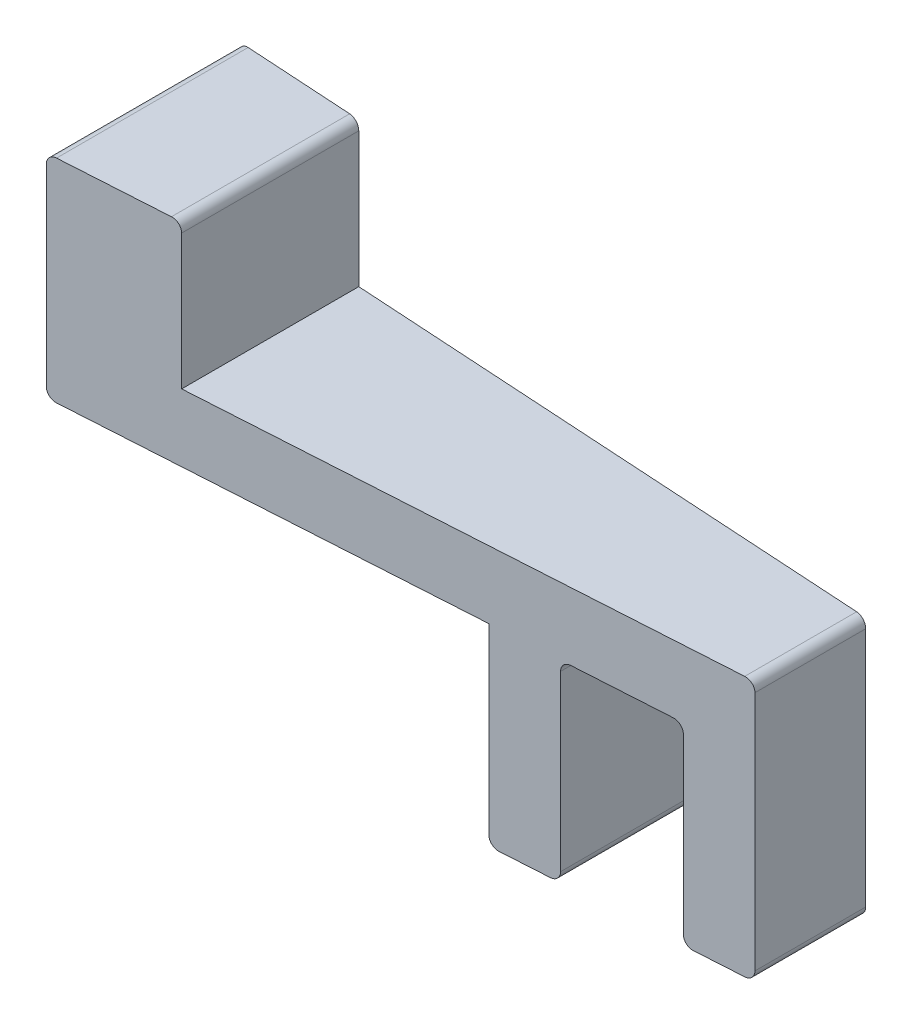
ISO-10303-21;
HEADER;
FILE_DESCRIPTION(('STEP AP214'),'2;1');
FILE_NAME('part.step','',(''),(''),'','','');
FILE_SCHEMA(('AUTOMOTIVE_DESIGN { 1 0 10303 214 1 1 1 1 }'));
ENDSEC;
DATA;
#1=APPLICATION_CONTEXT('core data for automotive mechanical design processes');
#2=APPLICATION_PROTOCOL_DEFINITION('international standard','automotive_design',2000,#1);
#3=PRODUCT_CONTEXT('',#1,'mechanical');
#4=PRODUCT('Part','Part','',(#3));
#5=PRODUCT_RELATED_PRODUCT_CATEGORY('part','',(#4));
#6=PRODUCT_DEFINITION_FORMATION('','',#4);
#7=PRODUCT_DEFINITION_CONTEXT('part definition',#1,'design');
#8=PRODUCT_DEFINITION('design','',#6,#7);
#9=PRODUCT_DEFINITION_SHAPE('','',#8);
#10=(LENGTH_UNIT() NAMED_UNIT(*) SI_UNIT(.MILLI.,.METRE.));
#11=(NAMED_UNIT(*) PLANE_ANGLE_UNIT() SI_UNIT($,.RADIAN.));
#12=(NAMED_UNIT(*) SI_UNIT($,.STERADIAN.) SOLID_ANGLE_UNIT());
#13=UNCERTAINTY_MEASURE_WITH_UNIT(LENGTH_MEASURE(1.E-05),#10,'distance_accuracy_value','');
#14=(GEOMETRIC_REPRESENTATION_CONTEXT(3) GLOBAL_UNCERTAINTY_ASSIGNED_CONTEXT((#13)) GLOBAL_UNIT_ASSIGNED_CONTEXT((#10,
#11,#12)) REPRESENTATION_CONTEXT('',''));
#15=CARTESIAN_POINT('',(0.,0.,0.));
#16=DIRECTION('',(0.,0.,1.));
#17=DIRECTION('',(1.,0.,0.));
#18=AXIS2_PLACEMENT_3D('',#15,#16,#17);
#19=CARTESIAN_POINT('',(13.2299438876044,7.,20.));
#20=DIRECTION('',(0.,-1.,0.));
#21=DIRECTION('',(1.,0.,0.));
#22=AXIS2_PLACEMENT_3D('',#19,#20,#21);
#23=PLANE('',#22);
#24=DIRECTION('',(0.,0.,-1.));
#25=VECTOR('',#24,1.);
#26=CARTESIAN_POINT('',(68.2657108504677,7.,20.));
#27=LINE('',#26,#25);
#28=CARTESIAN_POINT('',(68.2657108504677,7.,15.8064096500411));
#29=VERTEX_POINT('',#28);
#30=CARTESIAN_POINT('',(68.2657108504677,7.,4.19359034995889));
#31=VERTEX_POINT('',#30);
#32=EDGE_CURVE('E323',#29,#31,#27,.T.);
#33=ORIENTED_EDGE('',*,*,#32,.T.);
#34=DIRECTION('',(-0.998118476145567,0.,-0.0613148234674985));
#35=VECTOR('',#34,1.);
#36=CARTESIAN_POINT('',(14.4041949766079,7.,0.884855549005321));
#37=LINE('',#36,#35);
#38=CARTESIAN_POINT('',(13.2299438876044,7.,0.812720827577452));
#39=VERTEX_POINT('',#38);
#40=EDGE_CURVE('E238',#31,#39,#37,.T.);
#41=ORIENTED_EDGE('',*,*,#40,.T.);
#42=DIRECTION('',(0.,0.,-1.));
#43=VECTOR('',#42,1.);
#44=CARTESIAN_POINT('',(13.2299438876044,7.,20.));
#45=LINE('',#44,#43);
#46=CARTESIAN_POINT('',(13.2299438876044,7.,19.1872791724225));
#47=VERTEX_POINT('',#46);
#48=EDGE_CURVE('E11',#47,#39,#45,.T.);
#49=ORIENTED_EDGE('',*,*,#48,.F.);
#50=DIRECTION('',(0.998118476145567,0.,-0.0613148234674985));
#51=VECTOR('',#50,1.);
#52=CARTESIAN_POINT('',(13.1802058133176,7.,19.1903346025317));
#53=LINE('',#52,#51);
#54=EDGE_CURVE('E311',#47,#29,#53,.T.);
#55=ORIENTED_EDGE('',*,*,#54,.T.);
#56=EDGE_LOOP('',(#33,#41,#49,#55));
#57=FACE_BOUND('',#56,.T.);
#58=ADVANCED_FACE('F39',(#57),#23,.F.);
#59=CARTESIAN_POINT('',(13.2299438876044,21.,20.));
#60=DIRECTION('',(-1.,0.,0.));
#61=DIRECTION('',(0.,-1.,0.));
#62=AXIS2_PLACEMENT_3D('',#59,#60,#61);
#63=PLANE('',#62);
#64=ORIENTED_EDGE('',*,*,#48,.T.);
#65=DIRECTION('',(0.,1.,0.));
#66=VECTOR('',#65,1.);
#67=CARTESIAN_POINT('',(13.2299438876044,21.,0.812720827577454));
#68=LINE('',#67,#66);
#69=CARTESIAN_POINT('',(13.2299438876044,21.,0.812720827577454));
#70=VERTEX_POINT('',#69);
#71=EDGE_CURVE('E235',#39,#70,#68,.T.);
#72=ORIENTED_EDGE('',*,*,#71,.T.);
#73=DIRECTION('',(0.,0.,-1.));
#74=VECTOR('',#73,1.);
#75=CARTESIAN_POINT('',(13.2299438876044,21.,20.));
#76=LINE('',#75,#74);
#77=CARTESIAN_POINT('',(13.2299438876044,21.,19.1872791724225));
#78=VERTEX_POINT('',#77);
#79=EDGE_CURVE('E48',#78,#70,#76,.T.);
#80=ORIENTED_EDGE('',*,*,#79,.F.);
#81=DIRECTION('',(0.,-1.,0.));
#82=VECTOR('',#81,1.);
#83=CARTESIAN_POINT('',(13.2299438876044,21.,19.1872791724225));
#84=LINE('',#83,#82);
#85=EDGE_CURVE('E233',#78,#47,#84,.T.);
#86=ORIENTED_EDGE('',*,*,#85,.T.);
#87=EDGE_LOOP('',(#64,#72,#80,#86));
#88=FACE_BOUND('',#87,.T.);
#89=ADVANCED_FACE('F232',(#88),#63,.F.);
#90=CARTESIAN_POINT('',(12.2299438876044,21.,20.));
#91=DIRECTION('',(0.,0.,-1.));
#92=DIRECTION('',(-1.,0.,0.));
#93=AXIS2_PLACEMENT_3D('',#90,#91,#92);
#94=CYLINDRICAL_SURFACE('',#93,1.);
#95=ORIENTED_EDGE('',*,*,#79,.T.);
#96=CARTESIAN_POINT('',(12.2299438876044,21.,0.751290421335225));
#97=DIRECTION('',(-0.0613148234674985,0.,0.998118476145567));
#98=DIRECTION('',(-0.998118476145567,0.,-0.0613148234674985));
#99=AXIS2_PLACEMENT_3D('',#96,#97,#98);
#100=ELLIPSE('',#99,1.00188507065985,1.);
#101=CARTESIAN_POINT('',(12.2299438876044,22.,0.751290421335223));
#102=VERTEX_POINT('',#101);
#103=EDGE_CURVE('E195',#70,#102,#100,.T.);
#104=ORIENTED_EDGE('',*,*,#103,.T.);
#105=DIRECTION('',(0.,0.,-1.));
#106=VECTOR('',#105,1.);
#107=CARTESIAN_POINT('',(12.2299438876044,22.,20.));
#108=LINE('',#107,#106);
#109=CARTESIAN_POINT('',(12.2299438876044,22.,19.2487095786648));
#110=VERTEX_POINT('',#109);
#111=EDGE_CURVE('E204',#110,#102,#108,.T.);
#112=ORIENTED_EDGE('',*,*,#111,.F.);
#113=CARTESIAN_POINT('',(12.2299438876044,21.,19.2487095786648));
#114=DIRECTION('',(-0.0613148234674985,0.,-0.998118476145567));
#115=DIRECTION('',(0.998118476145567,0.,-0.0613148234674985));
#116=AXIS2_PLACEMENT_3D('',#113,#114,#115);
#117=ELLIPSE('',#116,1.00188507065985,1.);
#118=EDGE_CURVE('E228',#110,#78,#117,.T.);
#119=ORIENTED_EDGE('',*,*,#118,.T.);
#120=EDGE_LOOP('',(#95,#104,#112,#119));
#121=FACE_BOUND('',#120,.T.);
#122=ADVANCED_FACE('F227',(#121),#94,.T.);
#123=CARTESIAN_POINT('',(1.,22.,20.));
#124=DIRECTION('',(0.,-1.,0.));
#125=DIRECTION('',(0.,0.,-1.));
#126=AXIS2_PLACEMENT_3D('',#123,#124,#125);
#127=PLANE('',#126);
#128=ORIENTED_EDGE('',*,*,#111,.T.);
#129=DIRECTION('',(0.998118476145567,0.,0.0613148234674985));
#130=VECTOR('',#129,1.);
#131=CARTESIAN_POINT('',(81.3929177073017,22.,5.));
#132=LINE('',#131,#130);
#133=CARTESIAN_POINT('',(0.999999999999994,22.,0.0614304062422312));
#134=VERTEX_POINT('',#133);
#135=EDGE_CURVE('E186',#134,#102,#132,.T.);
#136=ORIENTED_EDGE('',*,*,#135,.F.);
#137=DIRECTION('',(0.,0.,-1.));
#138=VECTOR('',#137,1.);
#139=CARTESIAN_POINT('',(1.,22.,20.));
#140=LINE('',#139,#138);
#141=CARTESIAN_POINT('',(0.999999999999994,22.,19.9385695937578));
#142=VERTEX_POINT('',#141);
#143=EDGE_CURVE('E202',#142,#134,#140,.T.);
#144=ORIENTED_EDGE('',*,*,#143,.F.);
#145=DIRECTION('',(-0.998118476145567,0.,0.0613148234674985));
#146=VECTOR('',#145,1.);
#147=CARTESIAN_POINT('',(81.3929177073017,22.,15.));
#148=LINE('',#147,#146);
#149=EDGE_CURVE('E207',#110,#142,#148,.T.);
#150=ORIENTED_EDGE('',*,*,#149,.F.);
#151=EDGE_LOOP('',(#128,#136,#144,#150));
#152=FACE_BOUND('',#151,.T.);
#153=ADVANCED_FACE('F200',(#152),#127,.F.);
#154=CARTESIAN_POINT('',(1.,21.,20.));
#155=DIRECTION('',(0.,0.,-1.));
#156=DIRECTION('',(-1.,0.,0.));
#157=AXIS2_PLACEMENT_3D('',#154,#155,#156);
#158=CYLINDRICAL_SURFACE('',#157,1.);
#159=ORIENTED_EDGE('',*,*,#143,.T.);
#160=CARTESIAN_POINT('',(1.,21.,0.061430406242232));
#161=DIRECTION('',(-0.0613148234674985,0.,0.998118476145567));
#162=DIRECTION('',(-0.998118476145567,0.,-0.0613148234674985));
#163=AXIS2_PLACEMENT_3D('',#160,#161,#162);
#164=ELLIPSE('',#163,1.00188507065985,1.);
#165=CARTESIAN_POINT('',(0.,21.,0.));
#166=VERTEX_POINT('',#165);
#167=EDGE_CURVE('E183',#134,#166,#164,.T.);
#168=ORIENTED_EDGE('',*,*,#167,.T.);
#169=DIRECTION('',(0.,0.,-1.));
#170=VECTOR('',#169,1.);
#171=CARTESIAN_POINT('',(0.,21.,20.));
#172=LINE('',#171,#170);
#173=CARTESIAN_POINT('',(0.,21.,20.));
#174=VERTEX_POINT('',#173);
#175=EDGE_CURVE('E211',#174,#166,#172,.T.);
#176=ORIENTED_EDGE('',*,*,#175,.F.);
#177=CARTESIAN_POINT('',(1.,21.,19.9385695937578));
#178=DIRECTION('',(-0.0613148234674985,0.,-0.998118476145567));
#179=DIRECTION('',(0.998118476145567,0.,-0.0613148234674985));
#180=AXIS2_PLACEMENT_3D('',#177,#178,#179);
#181=ELLIPSE('',#180,1.00188507065985,1.);
#182=EDGE_CURVE('E54',#174,#142,#181,.T.);
#183=ORIENTED_EDGE('',*,*,#182,.T.);
#184=EDGE_LOOP('',(#159,#168,#176,#183));
#185=FACE_BOUND('',#184,.T.);
#186=ADVANCED_FACE('F209',(#185),#158,.T.);
#187=CARTESIAN_POINT('',(0.,1.00000000000001,20.));
#188=DIRECTION('',(1.,0.,0.));
#189=DIRECTION('',(0.,0.,-1.));
#190=AXIS2_PLACEMENT_3D('',#187,#188,#189);
#191=PLANE('',#190);
#192=DIRECTION('',(0.,-1.,0.));
#193=VECTOR('',#192,1.);
#194=CARTESIAN_POINT('',(0.,1.00000000000001,0.));
#195=LINE('',#194,#193);
#196=CARTESIAN_POINT('',(0.,1.00000000000001,0.));
#197=VERTEX_POINT('',#196);
#198=EDGE_CURVE('E189',#166,#197,#195,.T.);
#199=ORIENTED_EDGE('',*,*,#198,.T.);
#200=DIRECTION('',(0.,0.,-1.));
#201=VECTOR('',#200,1.);
#202=CARTESIAN_POINT('',(0.,1.00000000000001,20.));
#203=LINE('',#202,#201);
#204=CARTESIAN_POINT('',(0.,1.00000000000001,20.));
#205=VERTEX_POINT('',#204);
#206=EDGE_CURVE('E218',#205,#197,#203,.T.);
#207=ORIENTED_EDGE('',*,*,#206,.F.);
#208=DIRECTION('',(0.,-1.,0.));
#209=VECTOR('',#208,1.);
#210=CARTESIAN_POINT('',(0.,1.00000000000001,20.));
#211=LINE('',#210,#209);
#212=EDGE_CURVE('E320',#174,#205,#211,.T.);
#213=ORIENTED_EDGE('',*,*,#212,.F.);
#214=ORIENTED_EDGE('',*,*,#175,.T.);
#215=EDGE_LOOP('',(#199,#207,#213,#214));
#216=FACE_BOUND('',#215,.T.);
#217=ADVANCED_FACE('F395',(#216),#191,.F.);
#218=CARTESIAN_POINT('',(1.,1.,20.));
#219=DIRECTION('',(0.,0.,-1.));
#220=DIRECTION('',(-1.,0.,0.));
#221=AXIS2_PLACEMENT_3D('',#218,#219,#220);
#222=CYLINDRICAL_SURFACE('',#221,1.);
#223=ORIENTED_EDGE('',*,*,#206,.T.);
#224=CARTESIAN_POINT('',(1.,1.,0.061430406242232));
#225=DIRECTION('',(-0.0613148234674985,0.,0.998118476145567));
#226=DIRECTION('',(-0.998118476145567,0.,-0.0613148234674985));
#227=AXIS2_PLACEMENT_3D('',#224,#225,#226);
#228=ELLIPSE('',#227,1.00188507065985,1.);
#229=CARTESIAN_POINT('',(1.00000000000001,0.,0.0614304062422292));
#230=VERTEX_POINT('',#229);
#231=EDGE_CURVE('E245',#197,#230,#228,.T.);
#232=ORIENTED_EDGE('',*,*,#231,.T.);
#233=DIRECTION('',(0.,0.,-1.));
#234=VECTOR('',#233,1.);
#235=CARTESIAN_POINT('',(1.00000000000001,0.,20.));
#236=LINE('',#235,#234);
#237=CARTESIAN_POINT('',(1.00000000000001,0.,19.9385695937578));
#238=VERTEX_POINT('',#237);
#239=EDGE_CURVE('E384',#238,#230,#236,.T.);
#240=ORIENTED_EDGE('',*,*,#239,.F.);
#241=CARTESIAN_POINT('',(1.,1.,19.9385695937578));
#242=DIRECTION('',(-0.0613148234674985,0.,-0.998118476145567));
#243=DIRECTION('',(0.998118476145567,0.,-0.0613148234674985));
#244=AXIS2_PLACEMENT_3D('',#241,#242,#243);
#245=ELLIPSE('',#244,1.00188507065985,1.);
#246=EDGE_CURVE('E307',#238,#205,#245,.T.);
#247=ORIENTED_EDGE('',*,*,#246,.T.);
#248=EDGE_LOOP('',(#223,#232,#240,#247));
#249=FACE_BOUND('',#248,.T.);
#250=ADVANCED_FACE('F391',(#249),#222,.T.);
#251=CARTESIAN_POINT('',(1.00000000000001,0.,20.));
#252=DIRECTION('',(0.,1.,0.));
#253=DIRECTION('',(0.,0.,1.));
#254=AXIS2_PLACEMENT_3D('',#251,#252,#253);
#255=PLANE('',#254);
#256=ORIENTED_EDGE('',*,*,#239,.T.);
#257=DIRECTION('',(0.998118476145567,0.,0.0613148234674985));
#258=VECTOR('',#257,1.);
#259=CARTESIAN_POINT('',(2.22022965571344,0.,0.136389609701523));
#260=LINE('',#259,#258);
#261=CARTESIAN_POINT('',(43.2657108504677,0.,2.65783019390312));
#262=VERTEX_POINT('',#261);
#263=EDGE_CURVE('E401',#230,#262,#260,.T.);
#264=ORIENTED_EDGE('',*,*,#263,.T.);
#265=DIRECTION('',(0.,0.,-1.));
#266=VECTOR('',#265,1.);
#267=CARTESIAN_POINT('',(43.2657108504677,0.,20.));
#268=LINE('',#267,#266);
#269=CARTESIAN_POINT('',(43.2657108504677,0.,17.3421698060969));
#270=VERTEX_POINT('',#269);
#271=EDGE_CURVE('E380',#270,#262,#268,.T.);
#272=ORIENTED_EDGE('',*,*,#271,.F.);
#273=DIRECTION('',(-0.998118476145567,0.,0.0613148234674985));
#274=VECTOR('',#273,1.);
#275=CARTESIAN_POINT('',(0.996240492423157,0.,19.9388005418355));
#276=LINE('',#275,#274);
#277=EDGE_CURVE('E303',#270,#238,#276,.T.);
#278=ORIENTED_EDGE('',*,*,#277,.T.);
#279=EDGE_LOOP('',(#256,#264,#272,#278));
#280=FACE_BOUND('',#279,.T.);
#281=ADVANCED_FACE('F399',(#280),#255,.F.);
#282=CARTESIAN_POINT('',(43.2657108504677,0.,20.));
#283=DIRECTION('',(1.,0.,0.));
#284=DIRECTION('',(0.,0.,-1.));
#285=AXIS2_PLACEMENT_3D('',#282,#283,#284);
#286=PLANE('',#285);
#287=ORIENTED_EDGE('',*,*,#271,.T.);
#288=DIRECTION('',(0.,-1.,0.));
#289=VECTOR('',#288,1.);
#290=CARTESIAN_POINT('',(43.2657108504677,0.,2.65783019390312));
#291=LINE('',#290,#289);
#292=CARTESIAN_POINT('',(43.2657108504677,-19.,2.65783019390312));
#293=VERTEX_POINT('',#292);
#294=EDGE_CURVE('E406',#262,#293,#291,.T.);
#295=ORIENTED_EDGE('',*,*,#294,.T.);
#296=DIRECTION('',(0.,0.,-1.));
#297=VECTOR('',#296,1.);
#298=CARTESIAN_POINT('',(43.2657108504677,-19.,20.));
#299=LINE('',#298,#297);
#300=CARTESIAN_POINT('',(43.2657108504677,-19.,17.3421698060969));
#301=VERTEX_POINT('',#300);
#302=EDGE_CURVE('E376',#301,#293,#299,.T.);
#303=ORIENTED_EDGE('',*,*,#302,.F.);
#304=DIRECTION('',(0.,1.,0.));
#305=VECTOR('',#304,1.);
#306=CARTESIAN_POINT('',(43.2657108504677,0.,17.3421698060969));
#307=LINE('',#306,#305);
#308=EDGE_CURVE('E299',#301,#270,#307,.T.);
#309=ORIENTED_EDGE('',*,*,#308,.T.);
#310=EDGE_LOOP('',(#287,#295,#303,#309));
#311=FACE_BOUND('',#310,.T.);
#312=ADVANCED_FACE('F404',(#311),#286,.F.);
#313=CARTESIAN_POINT('',(44.2657108504677,-19.,20.));
#314=DIRECTION('',(0.,0.,-1.));
#315=DIRECTION('',(-1.,0.,0.));
#316=AXIS2_PLACEMENT_3D('',#313,#314,#315);
#317=CYLINDRICAL_SURFACE('',#316,1.);
#318=ORIENTED_EDGE('',*,*,#302,.T.);
#319=CARTESIAN_POINT('',(44.2657108504677,-19.,2.71926060014535));
#320=DIRECTION('',(-0.0613148234674985,0.,0.998118476145567));
#321=DIRECTION('',(-0.998118476145567,0.,-0.0613148234674985));
#322=AXIS2_PLACEMENT_3D('',#319,#320,#321);
#323=ELLIPSE('',#322,1.00188507065985,1.);
#324=CARTESIAN_POINT('',(44.2657108504677,-20.,2.71926060014535));
#325=VERTEX_POINT('',#324);
#326=EDGE_CURVE('E411',#293,#325,#323,.T.);
#327=ORIENTED_EDGE('',*,*,#326,.T.);
#328=DIRECTION('',(0.,0.,-1.));
#329=VECTOR('',#328,1.);
#330=CARTESIAN_POINT('',(44.2657108504677,-20.,20.));
#331=LINE('',#330,#329);
#332=CARTESIAN_POINT('',(44.2657108504677,-20.,17.2807393998546));
#333=VERTEX_POINT('',#332);
#334=EDGE_CURVE('E372',#333,#325,#331,.T.);
#335=ORIENTED_EDGE('',*,*,#334,.F.);
#336=CARTESIAN_POINT('',(44.2657108504677,-19.,17.2807393998546));
#337=DIRECTION('',(-0.0613148234674985,0.,-0.998118476145567));
#338=DIRECTION('',(0.998118476145567,0.,-0.0613148234674985));
#339=AXIS2_PLACEMENT_3D('',#336,#337,#338);
#340=ELLIPSE('',#339,1.00188507065985,1.);
#341=EDGE_CURVE('E295',#333,#301,#340,.T.);
#342=ORIENTED_EDGE('',*,*,#341,.T.);
#343=EDGE_LOOP('',(#318,#327,#335,#342));
#344=FACE_BOUND('',#343,.T.);
#345=ADVANCED_FACE('F409',(#344),#317,.T.);
#346=CARTESIAN_POINT('',(44.2657108504677,-20.,20.));
#347=DIRECTION('',(0.,1.,0.));
#348=DIRECTION('',(-1.,0.,0.));
#349=AXIS2_PLACEMENT_3D('',#346,#347,#348);
#350=PLANE('',#349);
#351=ORIENTED_EDGE('',*,*,#334,.T.);
#352=DIRECTION('',(0.998118476145567,0.,0.0613148234674985));
#353=VECTOR('',#352,1.);
#354=CARTESIAN_POINT('',(45.323282738421,-20.,2.78422767085268));
#355=LINE('',#354,#353);
#356=CARTESIAN_POINT('',(49.2657108504677,-20.,3.0264126313565));
#357=VERTEX_POINT('',#356);
#358=EDGE_CURVE('E416',#325,#357,#355,.T.);
#359=ORIENTED_EDGE('',*,*,#358,.T.);
#360=DIRECTION('',(0.,0.,-1.));
#361=VECTOR('',#360,1.);
#362=CARTESIAN_POINT('',(49.2657108504677,-20.,20.));
#363=LINE('',#362,#361);
#364=CARTESIAN_POINT('',(49.2657108504677,-20.,16.9735873686435));
#365=VERTEX_POINT('',#364);
#366=EDGE_CURVE('E368',#365,#357,#363,.T.);
#367=ORIENTED_EDGE('',*,*,#366,.F.);
#368=DIRECTION('',(-0.998118476145567,0.,0.0613148234674985));
#369=VECTOR('',#368,1.);
#370=CARTESIAN_POINT('',(44.0992935751307,-20.,17.2909624806843));
#371=LINE('',#370,#369);
#372=EDGE_CURVE('E291',#365,#333,#371,.T.);
#373=ORIENTED_EDGE('',*,*,#372,.T.);
#374=EDGE_LOOP('',(#351,#359,#367,#373));
#375=FACE_BOUND('',#374,.T.);
#376=ADVANCED_FACE('F414',(#375),#350,.F.);
#377=CARTESIAN_POINT('',(49.2657108504677,-19.,20.));
#378=DIRECTION('',(0.,0.,-1.));
#379=DIRECTION('',(-1.,0.,0.));
#380=AXIS2_PLACEMENT_3D('',#377,#378,#379);
#381=CYLINDRICAL_SURFACE('',#380,1.);
#382=ORIENTED_EDGE('',*,*,#366,.T.);
#383=CARTESIAN_POINT('',(49.2657108504677,-19.,3.0264126313565));
#384=DIRECTION('',(-0.0613148234674985,0.,0.998118476145567));
#385=DIRECTION('',(-0.998118476145567,0.,-0.0613148234674985));
#386=AXIS2_PLACEMENT_3D('',#383,#384,#385);
#387=ELLIPSE('',#386,1.00188507065985,1.);
#388=CARTESIAN_POINT('',(50.2657108504677,-19.,3.08784303759874));
#389=VERTEX_POINT('',#388);
#390=EDGE_CURVE('E421',#357,#389,#387,.T.);
#391=ORIENTED_EDGE('',*,*,#390,.T.);
#392=DIRECTION('',(0.,0.,-1.));
#393=VECTOR('',#392,1.);
#394=CARTESIAN_POINT('',(50.2657108504677,-19.,20.));
#395=LINE('',#394,#393);
#396=CARTESIAN_POINT('',(50.2657108504677,-19.,16.9121569624013));
#397=VERTEX_POINT('',#396);
#398=EDGE_CURVE('E364',#397,#389,#395,.T.);
#399=ORIENTED_EDGE('',*,*,#398,.F.);
#400=CARTESIAN_POINT('',(49.2657108504677,-19.,16.9735873686435));
#401=DIRECTION('',(-0.0613148234674985,0.,-0.998118476145567));
#402=DIRECTION('',(0.998118476145567,0.,-0.0613148234674985));
#403=AXIS2_PLACEMENT_3D('',#400,#401,#402);
#404=ELLIPSE('',#403,1.00188507065985,1.);
#405=EDGE_CURVE('E287',#397,#365,#404,.T.);
#406=ORIENTED_EDGE('',*,*,#405,.T.);
#407=EDGE_LOOP('',(#382,#391,#399,#406));
#408=FACE_BOUND('',#407,.T.);
#409=ADVANCED_FACE('F419',(#408),#381,.T.);
#410=CARTESIAN_POINT('',(50.2657108504677,-19.,20.));
#411=DIRECTION('',(-1.,0.,0.));
#412=DIRECTION('',(0.,-1.,0.));
#413=AXIS2_PLACEMENT_3D('',#410,#411,#412);
#414=PLANE('',#413);
#415=ORIENTED_EDGE('',*,*,#398,.T.);
#416=DIRECTION('',(0.,1.,0.));
#417=VECTOR('',#416,1.);
#418=CARTESIAN_POINT('',(50.2657108504677,-19.,3.08784303759874));
#419=LINE('',#418,#417);
#420=CARTESIAN_POINT('',(50.2657108504677,-1.,3.08784303759874));
#421=VERTEX_POINT('',#420);
#422=EDGE_CURVE('E426',#389,#421,#419,.T.);
#423=ORIENTED_EDGE('',*,*,#422,.T.);
#424=DIRECTION('',(0.,0.,-1.));
#425=VECTOR('',#424,1.);
#426=CARTESIAN_POINT('',(50.2657108504677,-1.,20.));
#427=LINE('',#426,#425);
#428=CARTESIAN_POINT('',(50.2657108504677,-1.,16.9121569624013));
#429=VERTEX_POINT('',#428);
#430=EDGE_CURVE('E360',#429,#421,#427,.T.);
#431=ORIENTED_EDGE('',*,*,#430,.F.);
#432=DIRECTION('',(0.,-1.,0.));
#433=VECTOR('',#432,1.);
#434=CARTESIAN_POINT('',(50.2657108504677,-19.,16.9121569624013));
#435=LINE('',#434,#433);
#436=EDGE_CURVE('E283',#429,#397,#435,.T.);
#437=ORIENTED_EDGE('',*,*,#436,.T.);
#438=EDGE_LOOP('',(#415,#423,#431,#437));
#439=FACE_BOUND('',#438,.T.);
#440=ADVANCED_FACE('F424',(#439),#414,.F.);
#441=CARTESIAN_POINT('',(51.2657108504677,-1.,20.));
#442=DIRECTION('',(0.,0.,-1.));
#443=DIRECTION('',(-1.,0.,0.));
#444=AXIS2_PLACEMENT_3D('',#441,#442,#443);
#445=CYLINDRICAL_SURFACE('',#444,1.);
#446=ORIENTED_EDGE('',*,*,#430,.T.);
#447=CARTESIAN_POINT('',(51.2657108504677,-1.,3.14927344384096));
#448=DIRECTION('',(-0.0613148234674985,0.,0.998118476145567));
#449=DIRECTION('',(-0.998118476145567,0.,-0.0613148234674985));
#450=AXIS2_PLACEMENT_3D('',#447,#448,#449);
#451=ELLIPSE('',#450,1.00188507065985,1.);
#452=CARTESIAN_POINT('',(51.2657108504677,0.,3.14927344384097));
#453=VERTEX_POINT('',#452);
#454=EDGE_CURVE('E431',#421,#453,#451,.F.);
#455=ORIENTED_EDGE('',*,*,#454,.T.);
#456=DIRECTION('',(0.,0.,-1.));
#457=VECTOR('',#456,1.);
#458=CARTESIAN_POINT('',(51.2657108504677,0.,20.));
#459=LINE('',#458,#457);
#460=CARTESIAN_POINT('',(51.2657108504677,0.,16.850726556159));
#461=VERTEX_POINT('',#460);
#462=EDGE_CURVE('E356',#461,#453,#459,.T.);
#463=ORIENTED_EDGE('',*,*,#462,.F.);
#464=CARTESIAN_POINT('',(51.2657108504677,-1.,16.850726556159));
#465=DIRECTION('',(-0.0613148234674985,0.,-0.998118476145567));
#466=DIRECTION('',(0.998118476145567,0.,-0.0613148234674985));
#467=AXIS2_PLACEMENT_3D('',#464,#465,#466);
#468=ELLIPSE('',#467,1.00188507065985,1.);
#469=EDGE_CURVE('E279',#461,#429,#468,.F.);
#470=ORIENTED_EDGE('',*,*,#469,.T.);
#471=EDGE_LOOP('',(#446,#455,#463,#470));
#472=FACE_BOUND('',#471,.T.);
#473=ADVANCED_FACE('F429',(#472),#445,.F.);
#474=CARTESIAN_POINT('',(51.2657108504677,0.,20.));
#475=DIRECTION('',(0.,1.,0.));
#476=DIRECTION('',(0.,0.,1.));
#477=AXIS2_PLACEMENT_3D('',#474,#475,#476);
#478=PLANE('',#477);
#479=ORIENTED_EDGE('',*,*,#462,.T.);
#480=DIRECTION('',(0.998118476145567,0.,0.0613148234674985));
#481=VECTOR('',#480,1.);
#482=CARTESIAN_POINT('',(52.296966185383,0.,3.21262387800428));
#483=LINE('',#482,#481);
#484=CARTESIAN_POINT('',(61.2657108504677,0.,3.76357750626328));
#485=VERTEX_POINT('',#484);
#486=EDGE_CURVE('E436',#453,#485,#483,.T.);
#487=ORIENTED_EDGE('',*,*,#486,.T.);
#488=DIRECTION('',(0.,0.,-1.));
#489=VECTOR('',#488,1.);
#490=CARTESIAN_POINT('',(61.2657108504677,0.,20.));
#491=LINE('',#490,#489);
#492=CARTESIAN_POINT('',(61.2657108504677,0.,16.2364224937367));
#493=VERTEX_POINT('',#492);
#494=EDGE_CURVE('E352',#493,#485,#491,.T.);
#495=ORIENTED_EDGE('',*,*,#494,.F.);
#496=DIRECTION('',(-0.998118476145567,0.,0.0613148234674985));
#497=VECTOR('',#496,1.);
#498=CARTESIAN_POINT('',(51.0729770220928,0.,16.8625662735327));
#499=LINE('',#498,#497);
#500=EDGE_CURVE('E275',#493,#461,#499,.T.);
#501=ORIENTED_EDGE('',*,*,#500,.T.);
#502=EDGE_LOOP('',(#479,#487,#495,#501));
#503=FACE_BOUND('',#502,.T.);
#504=ADVANCED_FACE('F434',(#503),#478,.F.);
#505=CARTESIAN_POINT('',(61.2657108504677,-1.,20.));
#506=DIRECTION('',(0.,0.,-1.));
#507=DIRECTION('',(-1.,0.,0.));
#508=AXIS2_PLACEMENT_3D('',#505,#506,#507);
#509=CYLINDRICAL_SURFACE('',#508,1.);
#510=ORIENTED_EDGE('',*,*,#494,.T.);
#511=CARTESIAN_POINT('',(61.2657108504677,-1.,3.76357750626328));
#512=DIRECTION('',(-0.0613148234674985,0.,0.998118476145567));
#513=DIRECTION('',(-0.998118476145567,0.,-0.0613148234674985));
#514=AXIS2_PLACEMENT_3D('',#511,#512,#513);
#515=ELLIPSE('',#514,1.00188507065985,1.);
#516=CARTESIAN_POINT('',(62.2657108504677,-1.,3.8250079125055));
#517=VERTEX_POINT('',#516);
#518=EDGE_CURVE('E441',#485,#517,#515,.F.);
#519=ORIENTED_EDGE('',*,*,#518,.T.);
#520=DIRECTION('',(0.,0.,-1.));
#521=VECTOR('',#520,1.);
#522=CARTESIAN_POINT('',(62.2657108504677,-1.,20.));
#523=LINE('',#522,#521);
#524=CARTESIAN_POINT('',(62.2657108504677,-1.,16.1749920874945));
#525=VERTEX_POINT('',#524);
#526=EDGE_CURVE('E348',#525,#517,#523,.T.);
#527=ORIENTED_EDGE('',*,*,#526,.F.);
#528=CARTESIAN_POINT('',(61.2657108504677,-1.,16.2364224937367));
#529=DIRECTION('',(-0.0613148234674985,0.,-0.998118476145567));
#530=DIRECTION('',(0.998118476145567,0.,-0.0613148234674985));
#531=AXIS2_PLACEMENT_3D('',#528,#529,#530);
#532=ELLIPSE('',#531,1.00188507065985,1.);
#533=EDGE_CURVE('E271',#525,#493,#532,.F.);
#534=ORIENTED_EDGE('',*,*,#533,.T.);
#535=EDGE_LOOP('',(#510,#519,#527,#534));
#536=FACE_BOUND('',#535,.T.);
#537=ADVANCED_FACE('F439',(#536),#509,.F.);
#538=CARTESIAN_POINT('',(62.2657108504677,-1.,20.));
#539=DIRECTION('',(1.,0.,0.));
#540=DIRECTION('',(0.,0.,-1.));
#541=AXIS2_PLACEMENT_3D('',#538,#539,#540);
#542=PLANE('',#541);
#543=ORIENTED_EDGE('',*,*,#526,.T.);
#544=DIRECTION('',(0.,-1.,0.));
#545=VECTOR('',#544,1.);
#546=CARTESIAN_POINT('',(62.2657108504677,-1.,3.8250079125055));
#547=LINE('',#546,#545);
#548=CARTESIAN_POINT('',(62.2657108504677,-19.,3.8250079125055));
#549=VERTEX_POINT('',#548);
#550=EDGE_CURVE('E446',#517,#549,#547,.T.);
#551=ORIENTED_EDGE('',*,*,#550,.T.);
#552=DIRECTION('',(0.,0.,-1.));
#553=VECTOR('',#552,1.);
#554=CARTESIAN_POINT('',(62.2657108504677,-19.,20.));
#555=LINE('',#554,#553);
#556=CARTESIAN_POINT('',(62.2657108504677,-19.,16.1749920874945));
#557=VERTEX_POINT('',#556);
#558=EDGE_CURVE('E344',#557,#549,#555,.T.);
#559=ORIENTED_EDGE('',*,*,#558,.F.);
#560=DIRECTION('',(0.,1.,0.));
#561=VECTOR('',#560,1.);
#562=CARTESIAN_POINT('',(62.2657108504677,-1.,16.1749920874945));
#563=LINE('',#562,#561);
#564=EDGE_CURVE('E267',#557,#525,#563,.T.);
#565=ORIENTED_EDGE('',*,*,#564,.T.);
#566=EDGE_LOOP('',(#543,#551,#559,#565));
#567=FACE_BOUND('',#566,.T.);
#568=ADVANCED_FACE('F444',(#567),#542,.F.);
#569=CARTESIAN_POINT('',(63.2657108504677,-19.,20.));
#570=DIRECTION('',(0.,0.,-1.));
#571=DIRECTION('',(-1.,0.,0.));
#572=AXIS2_PLACEMENT_3D('',#569,#570,#571);
#573=CYLINDRICAL_SURFACE('',#572,0.999999999999999);
#574=ORIENTED_EDGE('',*,*,#558,.T.);
#575=CARTESIAN_POINT('',(63.2657108504677,-19.,3.88643831874774));
#576=DIRECTION('',(-0.0613148234674985,0.,0.998118476145567));
#577=DIRECTION('',(-0.998118476145567,0.,-0.0613148234674985));
#578=AXIS2_PLACEMENT_3D('',#575,#576,#577);
#579=ELLIPSE('',#578,1.00188507065985,0.999999999999999);
#580=CARTESIAN_POINT('',(63.2657108504677,-20.,3.88643831874773));
#581=VERTEX_POINT('',#580);
#582=EDGE_CURVE('E451',#549,#581,#579,.T.);
#583=ORIENTED_EDGE('',*,*,#582,.T.);
#584=DIRECTION('',(0.,0.,-1.));
#585=VECTOR('',#584,1.);
#586=CARTESIAN_POINT('',(63.2657108504677,-20.,20.));
#587=LINE('',#586,#585);
#588=CARTESIAN_POINT('',(63.2657108504677,-20.,16.1135616812523));
#589=VERTEX_POINT('',#588);
#590=EDGE_CURVE('E340',#589,#581,#587,.T.);
#591=ORIENTED_EDGE('',*,*,#590,.F.);
#592=CARTESIAN_POINT('',(63.2657108504677,-19.,16.1135616812523));
#593=DIRECTION('',(-0.0613148234674985,0.,-0.998118476145567));
#594=DIRECTION('',(0.998118476145567,0.,-0.0613148234674985));
#595=AXIS2_PLACEMENT_3D('',#592,#593,#594);
#596=ELLIPSE('',#595,1.00188507065985,0.999999999999999);
#597=EDGE_CURVE('E263',#589,#557,#596,.T.);
#598=ORIENTED_EDGE('',*,*,#597,.T.);
#599=EDGE_LOOP('',(#574,#583,#591,#598));
#600=FACE_BOUND('',#599,.T.);
#601=ADVANCED_FACE('F449',(#600),#573,.T.);
#602=CARTESIAN_POINT('',(63.2657108504677,-20.,20.));
#603=DIRECTION('',(0.,1.,0.));
#604=DIRECTION('',(0.,0.,1.));
#605=AXIS2_PLACEMENT_3D('',#602,#603,#604);
#606=PLANE('',#605);
#607=ORIENTED_EDGE('',*,*,#590,.T.);
#608=DIRECTION('',(0.998118476145567,0.,0.0613148234674985));
#609=VECTOR('',#608,1.);
#610=CARTESIAN_POINT('',(64.2518520944608,-20.,3.94701737597845));
#611=LINE('',#610,#609);
#612=CARTESIAN_POINT('',(68.2657108504677,-20.,4.19359034995889));
#613=VERTEX_POINT('',#612);
#614=EDGE_CURVE('E456',#581,#613,#611,.T.);
#615=ORIENTED_EDGE('',*,*,#614,.T.);
#616=DIRECTION('',(0.,0.,-1.));
#617=VECTOR('',#616,1.);
#618=CARTESIAN_POINT('',(68.2657108504677,-20.,20.));
#619=LINE('',#618,#617);
#620=CARTESIAN_POINT('',(68.2657108504677,-20.,15.8064096500411));
#621=VERTEX_POINT('',#620);
#622=EDGE_CURVE('E336',#621,#613,#619,.T.);
#623=ORIENTED_EDGE('',*,*,#622,.F.);
#624=DIRECTION('',(-0.998118476145567,0.,0.0613148234674985));
#625=VECTOR('',#624,1.);
#626=CARTESIAN_POINT('',(63.0278629311705,-20.,16.1281727755586));
#627=LINE('',#626,#625);
#628=EDGE_CURVE('E259',#621,#589,#627,.T.);
#629=ORIENTED_EDGE('',*,*,#628,.T.);
#630=EDGE_LOOP('',(#607,#615,#623,#629));
#631=FACE_BOUND('',#630,.T.);
#632=ADVANCED_FACE('F454',(#631),#606,.F.);
#633=CARTESIAN_POINT('',(68.2657108504677,-19.,20.));
#634=DIRECTION('',(0.,0.,-1.));
#635=DIRECTION('',(-1.,0.,0.));
#636=AXIS2_PLACEMENT_3D('',#633,#634,#635);
#637=CYLINDRICAL_SURFACE('',#636,0.999999999999999);
#638=ORIENTED_EDGE('',*,*,#622,.T.);
#639=CARTESIAN_POINT('',(68.2657108504677,-19.,4.19359034995889));
#640=DIRECTION('',(-0.0613148234674985,0.,0.998118476145567));
#641=DIRECTION('',(-0.998118476145567,0.,-0.0613148234674985));
#642=AXIS2_PLACEMENT_3D('',#639,#640,#641);
#643=ELLIPSE('',#642,1.00188507065985,0.999999999999999);
#644=CARTESIAN_POINT('',(69.2657108504677,-19.,4.25502075620112));
#645=VERTEX_POINT('',#644);
#646=EDGE_CURVE('E461',#613,#645,#643,.T.);
#647=ORIENTED_EDGE('',*,*,#646,.T.);
#648=DIRECTION('',(0.,0.,-1.));
#649=VECTOR('',#648,1.);
#650=CARTESIAN_POINT('',(69.2657108504677,-19.,20.));
#651=LINE('',#650,#649);
#652=CARTESIAN_POINT('',(69.2657108504677,-19.,15.7449792437989));
#653=VERTEX_POINT('',#652);
#654=EDGE_CURVE('E332',#653,#645,#651,.T.);
#655=ORIENTED_EDGE('',*,*,#654,.F.);
#656=CARTESIAN_POINT('',(68.2657108504677,-19.,15.8064096500411));
#657=DIRECTION('',(-0.0613148234674985,0.,-0.998118476145567));
#658=DIRECTION('',(0.998118476145567,0.,-0.0613148234674985));
#659=AXIS2_PLACEMENT_3D('',#656,#657,#658);
#660=ELLIPSE('',#659,1.00188507065985,0.999999999999999);
#661=EDGE_CURVE('E255',#653,#621,#660,.T.);
#662=ORIENTED_EDGE('',*,*,#661,.T.);
#663=EDGE_LOOP('',(#638,#647,#655,#662));
#664=FACE_BOUND('',#663,.T.);
#665=ADVANCED_FACE('F459',(#664),#637,.T.);
#666=CARTESIAN_POINT('',(69.2657108504677,-19.,20.));
#667=DIRECTION('',(-1.,0.,0.));
#668=DIRECTION('',(0.,0.,1.));
#669=AXIS2_PLACEMENT_3D('',#666,#667,#668);
#670=PLANE('',#669);
#671=ORIENTED_EDGE('',*,*,#654,.T.);
#672=DIRECTION('',(0.,1.,0.));
#673=VECTOR('',#672,1.);
#674=CARTESIAN_POINT('',(69.2657108504677,-19.,4.25502075620112));
#675=LINE('',#674,#673);
#676=CARTESIAN_POINT('',(69.2657108504677,6.,4.25502075620112));
#677=VERTEX_POINT('',#676);
#678=EDGE_CURVE('E466',#645,#677,#675,.T.);
#679=ORIENTED_EDGE('',*,*,#678,.T.);
#680=DIRECTION('',(0.,0.,-1.));
#681=VECTOR('',#680,1.);
#682=CARTESIAN_POINT('',(69.2657108504677,6.,20.));
#683=LINE('',#682,#681);
#684=CARTESIAN_POINT('',(69.2657108504677,6.,15.7449792437989));
#685=VERTEX_POINT('',#684);
#686=EDGE_CURVE('E329',#685,#677,#683,.T.);
#687=ORIENTED_EDGE('',*,*,#686,.F.);
#688=DIRECTION('',(0.,-1.,0.));
#689=VECTOR('',#688,1.);
#690=CARTESIAN_POINT('',(69.2657108504677,-19.,15.7449792437989));
#691=LINE('',#690,#689);
#692=EDGE_CURVE('E252',#685,#653,#691,.T.);
#693=ORIENTED_EDGE('',*,*,#692,.T.);
#694=EDGE_LOOP('',(#671,#679,#687,#693));
#695=FACE_BOUND('',#694,.T.);
#696=ADVANCED_FACE('F464',(#695),#670,.F.);
#697=CARTESIAN_POINT('',(68.2657108504677,6.,20.));
#698=DIRECTION('',(0.,0.,-1.));
#699=DIRECTION('',(-1.,0.,0.));
#700=AXIS2_PLACEMENT_3D('',#697,#698,#699);
#701=CYLINDRICAL_SURFACE('',#700,1.);
#702=ORIENTED_EDGE('',*,*,#686,.T.);
#703=CARTESIAN_POINT('',(68.2657108504677,6.,4.19359034995889));
#704=DIRECTION('',(-0.0613148234674985,0.,0.998118476145567));
#705=DIRECTION('',(-0.998118476145567,0.,-0.0613148234674985));
#706=AXIS2_PLACEMENT_3D('',#703,#704,#705);
#707=ELLIPSE('',#706,1.00188507065985,1.);
#708=EDGE_CURVE('E206',#677,#31,#707,.T.);
#709=ORIENTED_EDGE('',*,*,#708,.T.);
#710=ORIENTED_EDGE('',*,*,#32,.F.);
#711=CARTESIAN_POINT('',(68.2657108504677,6.,15.8064096500411));
#712=DIRECTION('',(-0.0613148234674985,0.,-0.998118476145567));
#713=DIRECTION('',(0.998118476145567,0.,-0.0613148234674985));
#714=AXIS2_PLACEMENT_3D('',#711,#712,#713);
#715=ELLIPSE('',#714,1.00188507065985,1.);
#716=EDGE_CURVE('E194',#29,#685,#715,.T.);
#717=ORIENTED_EDGE('',*,*,#716,.T.);
#718=EDGE_LOOP('',(#702,#709,#710,#717));
#719=FACE_BOUND('',#718,.T.);
#720=ADVANCED_FACE('F469',(#719),#701,.T.);
#721=CARTESIAN_POINT('',(81.3929177073017,-60.,5.));
#722=DIRECTION('',(-0.0613148234674985,0.,0.998118476145567));
#723=DIRECTION('',(0.998118476145567,0.,0.0613148234674985));
#724=AXIS2_PLACEMENT_3D('',#721,#722,#723);
#725=PLANE('',#724);
#726=ORIENTED_EDGE('',*,*,#135,.T.);
#727=ORIENTED_EDGE('',*,*,#103,.F.);
#728=ORIENTED_EDGE('',*,*,#71,.F.);
#729=ORIENTED_EDGE('',*,*,#40,.F.);
#730=ORIENTED_EDGE('',*,*,#708,.F.);
#731=ORIENTED_EDGE('',*,*,#678,.F.);
#732=ORIENTED_EDGE('',*,*,#646,.F.);
#733=ORIENTED_EDGE('',*,*,#614,.F.);
#734=ORIENTED_EDGE('',*,*,#582,.F.);
#735=ORIENTED_EDGE('',*,*,#550,.F.);
#736=ORIENTED_EDGE('',*,*,#518,.F.);
#737=ORIENTED_EDGE('',*,*,#486,.F.);
#738=ORIENTED_EDGE('',*,*,#454,.F.);
#739=ORIENTED_EDGE('',*,*,#422,.F.);
#740=ORIENTED_EDGE('',*,*,#390,.F.);
#741=ORIENTED_EDGE('',*,*,#358,.F.);
#742=ORIENTED_EDGE('',*,*,#326,.F.);
#743=ORIENTED_EDGE('',*,*,#294,.F.);
#744=ORIENTED_EDGE('',*,*,#263,.F.);
#745=ORIENTED_EDGE('',*,*,#231,.F.);
#746=ORIENTED_EDGE('',*,*,#198,.F.);
#747=ORIENTED_EDGE('',*,*,#167,.F.);
#748=EDGE_LOOP('',(#726,#727,#728,#729,#730,#731,#732,#733,#734,#735,#736,#737,#738,#739,#740,
#741,#742,#743,#744,#745,#746,#747));
#749=FACE_BOUND('',#748,.T.);
#750=ADVANCED_FACE('F185',(#749),#725,.F.);
#751=CARTESIAN_POINT('',(81.3929177073017,-60.,15.));
#752=DIRECTION('',(-0.0613148234674985,0.,-0.998118476145567));
#753=DIRECTION('',(-0.998118476145567,0.,0.0613148234674985));
#754=AXIS2_PLACEMENT_3D('',#751,#752,#753);
#755=PLANE('',#754);
#756=ORIENTED_EDGE('',*,*,#212,.T.);
#757=ORIENTED_EDGE('',*,*,#246,.F.);
#758=ORIENTED_EDGE('',*,*,#277,.F.);
#759=ORIENTED_EDGE('',*,*,#308,.F.);
#760=ORIENTED_EDGE('',*,*,#341,.F.);
#761=ORIENTED_EDGE('',*,*,#372,.F.);
#762=ORIENTED_EDGE('',*,*,#405,.F.);
#763=ORIENTED_EDGE('',*,*,#436,.F.);
#764=ORIENTED_EDGE('',*,*,#469,.F.);
#765=ORIENTED_EDGE('',*,*,#500,.F.);
#766=ORIENTED_EDGE('',*,*,#533,.F.);
#767=ORIENTED_EDGE('',*,*,#564,.F.);
#768=ORIENTED_EDGE('',*,*,#597,.F.);
#769=ORIENTED_EDGE('',*,*,#628,.F.);
#770=ORIENTED_EDGE('',*,*,#661,.F.);
#771=ORIENTED_EDGE('',*,*,#692,.F.);
#772=ORIENTED_EDGE('',*,*,#716,.F.);
#773=ORIENTED_EDGE('',*,*,#54,.F.);
#774=ORIENTED_EDGE('',*,*,#85,.F.);
#775=ORIENTED_EDGE('',*,*,#118,.F.);
#776=ORIENTED_EDGE('',*,*,#149,.T.);
#777=ORIENTED_EDGE('',*,*,#182,.F.);
#778=EDGE_LOOP('',(#756,#757,#758,#759,#760,#761,#762,#763,#764,#765,#766,#767,#768,#769,#770,
#771,#772,#773,#774,#775,#776,#777));
#779=FACE_BOUND('',#778,.T.);
#780=ADVANCED_FACE('F396',(#779),#755,.F.);
#781=CLOSED_SHELL('',(#58,#89,#122,#153,#186,#217,#250,#281,#312,#345,#376,#409,#440,#473,#504,
#537,#568,#601,#632,#665,#696,#720,#750,#780));
#782=MANIFOLD_SOLID_BREP('B2',#781);
#783=ADVANCED_BREP_SHAPE_REPRESENTATION('',(#18,#782),#14);
#784=SHAPE_DEFINITION_REPRESENTATION(#9,#783);
ENDSEC;
END-ISO-10303-21;
